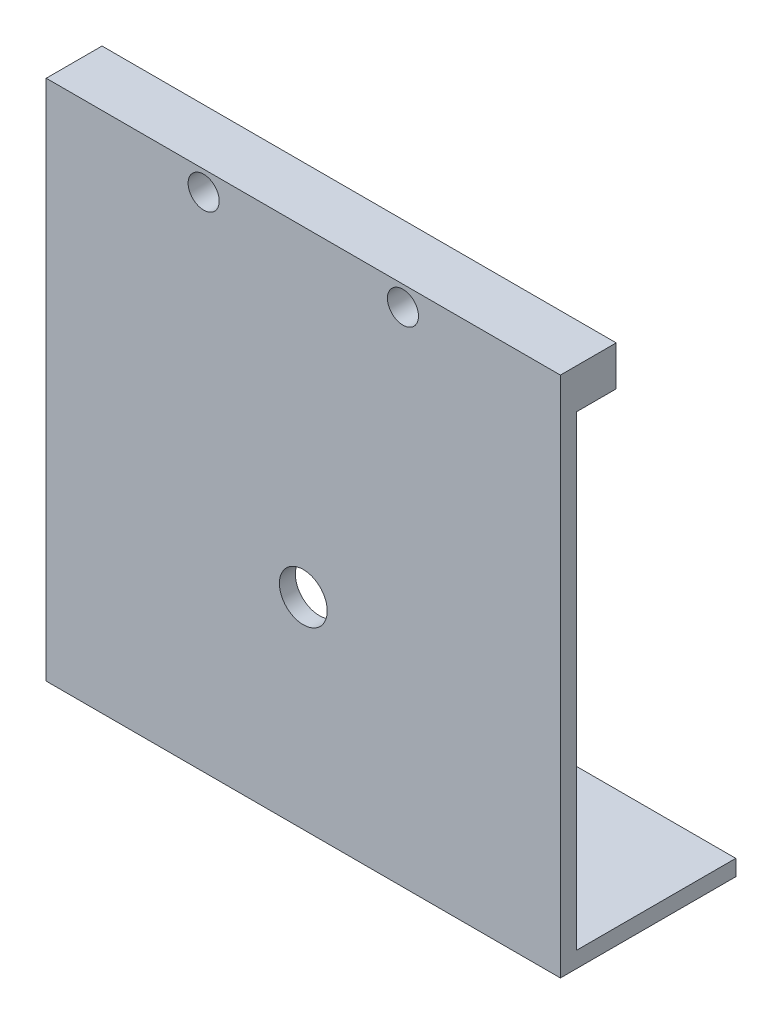
ISO-10303-21;
HEADER;
FILE_DESCRIPTION(('STEP AP214'),'2;1');
FILE_NAME('part.step','',(''),(''),'','','');
FILE_SCHEMA(('AUTOMOTIVE_DESIGN { 1 0 10303 214 1 1 1 1 }'));
ENDSEC;
DATA;
#1=APPLICATION_CONTEXT('core data for automotive mechanical design processes');
#2=APPLICATION_PROTOCOL_DEFINITION('international standard','automotive_design',2000,#1);
#3=PRODUCT_CONTEXT('',#1,'mechanical');
#4=PRODUCT('Part','Part','',(#3));
#5=PRODUCT_RELATED_PRODUCT_CATEGORY('part','',(#4));
#6=PRODUCT_DEFINITION_FORMATION('','',#4);
#7=PRODUCT_DEFINITION_CONTEXT('part definition',#1,'design');
#8=PRODUCT_DEFINITION('design','',#6,#7);
#9=PRODUCT_DEFINITION_SHAPE('','',#8);
#10=(LENGTH_UNIT() NAMED_UNIT(*) SI_UNIT(.MILLI.,.METRE.));
#11=(NAMED_UNIT(*) PLANE_ANGLE_UNIT() SI_UNIT($,.RADIAN.));
#12=(NAMED_UNIT(*) SI_UNIT($,.STERADIAN.) SOLID_ANGLE_UNIT());
#13=UNCERTAINTY_MEASURE_WITH_UNIT(LENGTH_MEASURE(1.E-05),#10,'distance_accuracy_value','');
#14=(GEOMETRIC_REPRESENTATION_CONTEXT(3) GLOBAL_UNCERTAINTY_ASSIGNED_CONTEXT((#13)) GLOBAL_UNIT_ASSIGNED_CONTEXT((#10,
#11,#12)) REPRESENTATION_CONTEXT('',''));
#15=CARTESIAN_POINT('',(0.,0.,0.));
#16=DIRECTION('',(0.,0.,1.));
#17=DIRECTION('',(1.,0.,0.));
#18=AXIS2_PLACEMENT_3D('',#15,#16,#17);
#19=CARTESIAN_POINT('',(0.,0.,0.));
#20=DIRECTION('',(0.,0.,1.));
#21=DIRECTION('',(1.,0.,0.));
#22=AXIS2_PLACEMENT_3D('',#19,#20,#21);
#23=PLANE('',#22);
#24=DIRECTION('',(1.,0.,0.));
#25=VECTOR('',#24,1.);
#26=CARTESIAN_POINT('',(-32.25,33.75,0.));
#27=LINE('',#26,#25);
#28=CARTESIAN_POINT('',(-32.25,33.75,0.));
#29=VERTEX_POINT('',#28);
#30=CARTESIAN_POINT('',(32.25,33.75,0.));
#31=VERTEX_POINT('',#30);
#32=EDGE_CURVE('E136',#29,#31,#27,.T.);
#33=ORIENTED_EDGE('',*,*,#32,.T.);
#34=DIRECTION('',(0.,1.,0.));
#35=VECTOR('',#34,1.);
#36=CARTESIAN_POINT('',(32.25,-26.75,0.));
#37=LINE('',#36,#35);
#38=CARTESIAN_POINT('',(32.25,-24.75,0.));
#39=VERTEX_POINT('',#38);
#40=EDGE_CURVE('E144',#39,#31,#37,.T.);
#41=ORIENTED_EDGE('',*,*,#40,.F.);
#42=DIRECTION('',(1.,0.,0.));
#43=VECTOR('',#42,1.);
#44=CARTESIAN_POINT('',(32.25,-24.75,0.));
#45=LINE('',#44,#43);
#46=CARTESIAN_POINT('',(-32.25,-24.75,0.));
#47=VERTEX_POINT('',#46);
#48=EDGE_CURVE('E138',#47,#39,#45,.T.);
#49=ORIENTED_EDGE('',*,*,#48,.F.);
#50=DIRECTION('',(0.,-1.,0.));
#51=VECTOR('',#50,1.);
#52=CARTESIAN_POINT('',(-32.25,-26.75,0.));
#53=LINE('',#52,#51);
#54=EDGE_CURVE('E132',#29,#47,#53,.T.);
#55=ORIENTED_EDGE('',*,*,#54,.F.);
#56=EDGE_LOOP('',(#33,#41,#49,#55));
#57=FACE_BOUND('',#56,.T.);
#58=CARTESIAN_POINT('',(0.,-1.5,0.));
#59=DIRECTION('',(0.,0.,-1.));
#60=DIRECTION('',(-1.,0.,0.));
#61=AXIS2_PLACEMENT_3D('',#58,#59,#60);
#62=CIRCLE('',#61,3.);
#63=CARTESIAN_POINT('',(-3.,-1.5,0.));
#64=VERTEX_POINT('',#63);
#65=EDGE_CURVE('E154',#64,#64,#62,.T.);
#66=ORIENTED_EDGE('',*,*,#65,.F.);
#67=EDGE_LOOP('',(#66));
#68=FACE_BOUND('',#67,.T.);
#69=ADVANCED_FACE('F65',(#57,#68),#23,.F.);
#70=CARTESIAN_POINT('',(-32.25,-26.75,2.));
#71=DIRECTION('',(1.,0.,0.));
#72=DIRECTION('',(0.,0.,-1.));
#73=AXIS2_PLACEMENT_3D('',#70,#71,#72);
#74=PLANE('',#73);
#75=ORIENTED_EDGE('',*,*,#54,.T.);
#76=DIRECTION('',(0.,0.,1.));
#77=VECTOR('',#76,1.);
#78=CARTESIAN_POINT('',(-32.25,-24.75,-20.));
#79=LINE('',#78,#77);
#80=CARTESIAN_POINT('',(-32.25,-24.75,-20.));
#81=VERTEX_POINT('',#80);
#82=EDGE_CURVE('E145',#81,#47,#79,.T.);
#83=ORIENTED_EDGE('',*,*,#82,.F.);
#84=DIRECTION('',(0.,1.,0.));
#85=VECTOR('',#84,1.);
#86=CARTESIAN_POINT('',(-32.25,-26.75,-20.));
#87=LINE('',#86,#85);
#88=CARTESIAN_POINT('',(-32.25,-26.75,-20.));
#89=VERTEX_POINT('',#88);
#90=EDGE_CURVE('E194',#89,#81,#87,.T.);
#91=ORIENTED_EDGE('',*,*,#90,.F.);
#92=DIRECTION('',(0.,0.,-1.));
#93=VECTOR('',#92,1.);
#94=CARTESIAN_POINT('',(-32.25,-26.75,2.));
#95=LINE('',#94,#93);
#96=CARTESIAN_POINT('',(-32.25,-26.75,2.));
#97=VERTEX_POINT('',#96);
#98=EDGE_CURVE('E12',#97,#89,#95,.T.);
#99=ORIENTED_EDGE('',*,*,#98,.F.);
#100=DIRECTION('',(0.,-1.,0.));
#101=VECTOR('',#100,1.);
#102=CARTESIAN_POINT('',(-32.25,-26.75,2.));
#103=LINE('',#102,#101);
#104=CARTESIAN_POINT('',(-32.25,38.75,2.));
#105=VERTEX_POINT('',#104);
#106=EDGE_CURVE('E206',#105,#97,#103,.T.);
#107=ORIENTED_EDGE('',*,*,#106,.F.);
#108=DIRECTION('',(0.,0.,-1.));
#109=VECTOR('',#108,1.);
#110=CARTESIAN_POINT('',(-32.25,38.75,2.));
#111=LINE('',#110,#109);
#112=CARTESIAN_POINT('',(-32.25,38.75,-5.));
#113=VERTEX_POINT('',#112);
#114=EDGE_CURVE('E239',#105,#113,#111,.T.);
#115=ORIENTED_EDGE('',*,*,#114,.T.);
#116=DIRECTION('',(0.,-1.,0.));
#117=VECTOR('',#116,1.);
#118=CARTESIAN_POINT('',(-32.25,38.75,-5.));
#119=LINE('',#118,#117);
#120=CARTESIAN_POINT('',(-32.25,33.75,-5.));
#121=VERTEX_POINT('',#120);
#122=EDGE_CURVE('E158',#113,#121,#119,.T.);
#123=ORIENTED_EDGE('',*,*,#122,.T.);
#124=DIRECTION('',(0.,0.,-1.));
#125=VECTOR('',#124,1.);
#126=CARTESIAN_POINT('',(-32.25,33.75,0.));
#127=LINE('',#126,#125);
#128=EDGE_CURVE('E150',#29,#121,#127,.T.);
#129=ORIENTED_EDGE('',*,*,#128,.F.);
#130=EDGE_LOOP('',(#75,#83,#91,#99,#107,#115,#123,#129));
#131=FACE_BOUND('',#130,.T.);
#132=ADVANCED_FACE('F67',(#131),#74,.F.);
#133=CARTESIAN_POINT('',(32.25,-26.75,2.));
#134=DIRECTION('',(0.,1.,0.));
#135=DIRECTION('',(-1.,0.,0.));
#136=AXIS2_PLACEMENT_3D('',#133,#134,#135);
#137=PLANE('',#136);
#138=ORIENTED_EDGE('',*,*,#98,.T.);
#139=DIRECTION('',(-1.,0.,0.));
#140=VECTOR('',#139,1.);
#141=CARTESIAN_POINT('',(32.25,-26.75,-20.));
#142=LINE('',#141,#140);
#143=CARTESIAN_POINT('',(32.25,-26.75,-20.));
#144=VERTEX_POINT('',#143);
#145=EDGE_CURVE('E190',#144,#89,#142,.T.);
#146=ORIENTED_EDGE('',*,*,#145,.F.);
#147=DIRECTION('',(0.,0.,-1.));
#148=VECTOR('',#147,1.);
#149=CARTESIAN_POINT('',(32.25,-26.75,2.));
#150=LINE('',#149,#148);
#151=CARTESIAN_POINT('',(32.25,-26.75,2.));
#152=VERTEX_POINT('',#151);
#153=EDGE_CURVE('E75',#152,#144,#150,.T.);
#154=ORIENTED_EDGE('',*,*,#153,.F.);
#155=DIRECTION('',(1.,0.,0.));
#156=VECTOR('',#155,1.);
#157=CARTESIAN_POINT('',(32.25,-26.75,2.));
#158=LINE('',#157,#156);
#159=EDGE_CURVE('E90',#97,#152,#158,.T.);
#160=ORIENTED_EDGE('',*,*,#159,.F.);
#161=EDGE_LOOP('',(#138,#146,#154,#160));
#162=FACE_BOUND('',#161,.T.);
#163=ADVANCED_FACE('F223',(#162),#137,.F.);
#164=CARTESIAN_POINT('',(32.25,-26.75,2.));
#165=DIRECTION('',(-1.,0.,0.));
#166=DIRECTION('',(0.,0.,1.));
#167=AXIS2_PLACEMENT_3D('',#164,#165,#166);
#168=PLANE('',#167);
#169=DIRECTION('',(0.,0.,-1.));
#170=VECTOR('',#169,1.);
#171=CARTESIAN_POINT('',(32.25,38.75,2.));
#172=LINE('',#171,#170);
#173=CARTESIAN_POINT('',(32.25,38.75,2.));
#174=VERTEX_POINT('',#173);
#175=CARTESIAN_POINT('',(32.25,38.75,-5.));
#176=VERTEX_POINT('',#175);
#177=EDGE_CURVE('E180',#174,#176,#172,.T.);
#178=ORIENTED_EDGE('',*,*,#177,.F.);
#179=DIRECTION('',(0.,1.,0.));
#180=VECTOR('',#179,1.);
#181=CARTESIAN_POINT('',(32.25,-26.75,2.));
#182=LINE('',#181,#180);
#183=EDGE_CURVE('E211',#152,#174,#182,.T.);
#184=ORIENTED_EDGE('',*,*,#183,.F.);
#185=ORIENTED_EDGE('',*,*,#153,.T.);
#186=DIRECTION('',(0.,-1.,0.));
#187=VECTOR('',#186,1.);
#188=CARTESIAN_POINT('',(32.25,-26.75,-20.));
#189=LINE('',#188,#187);
#190=CARTESIAN_POINT('',(32.25,-24.75,-20.));
#191=VERTEX_POINT('',#190);
#192=EDGE_CURVE('E186',#191,#144,#189,.T.);
#193=ORIENTED_EDGE('',*,*,#192,.F.);
#194=DIRECTION('',(0.,0.,1.));
#195=VECTOR('',#194,1.);
#196=CARTESIAN_POINT('',(32.25,-24.75,-20.));
#197=LINE('',#196,#195);
#198=EDGE_CURVE('E82',#191,#39,#197,.T.);
#199=ORIENTED_EDGE('',*,*,#198,.T.);
#200=ORIENTED_EDGE('',*,*,#40,.T.);
#201=DIRECTION('',(0.,0.,-1.));
#202=VECTOR('',#201,1.);
#203=CARTESIAN_POINT('',(32.25,33.75,0.));
#204=LINE('',#203,#202);
#205=CARTESIAN_POINT('',(32.25,33.75,-5.));
#206=VERTEX_POINT('',#205);
#207=EDGE_CURVE('E152',#31,#206,#204,.T.);
#208=ORIENTED_EDGE('',*,*,#207,.T.);
#209=DIRECTION('',(0.,-1.,0.));
#210=VECTOR('',#209,1.);
#211=CARTESIAN_POINT('',(32.25,38.75,-5.));
#212=LINE('',#211,#210);
#213=EDGE_CURVE('E161',#176,#206,#212,.T.);
#214=ORIENTED_EDGE('',*,*,#213,.F.);
#215=EDGE_LOOP('',(#178,#184,#185,#193,#199,#200,#208,#214));
#216=FACE_BOUND('',#215,.T.);
#217=ADVANCED_FACE('F221',(#216),#168,.F.);
#218=CARTESIAN_POINT('',(0.,0.,2.));
#219=DIRECTION('',(0.,0.,1.));
#220=DIRECTION('',(1.,0.,0.));
#221=AXIS2_PLACEMENT_3D('',#218,#219,#220);
#222=PLANE('',#221);
#223=CARTESIAN_POINT('',(12.5,36.25,2.00000000000001));
#224=DIRECTION('',(0.,0.,-1.));
#225=DIRECTION('',(0.,1.,0.));
#226=AXIS2_PLACEMENT_3D('',#223,#224,#225);
#227=CIRCLE('',#226,1.95);
#228=CARTESIAN_POINT('',(12.5,38.2,2.00000000000001));
#229=VERTEX_POINT('',#228);
#230=EDGE_CURVE('E174',#229,#229,#227,.T.);
#231=ORIENTED_EDGE('',*,*,#230,.T.);
#232=EDGE_LOOP('',(#231));
#233=FACE_BOUND('',#232,.T.);
#234=CARTESIAN_POINT('',(-12.5,36.25,2.00000000000001));
#235=DIRECTION('',(0.,0.,-1.));
#236=DIRECTION('',(0.,-1.,0.));
#237=AXIS2_PLACEMENT_3D('',#234,#235,#236);
#238=CIRCLE('',#237,1.95);
#239=CARTESIAN_POINT('',(-12.5,34.3,2.00000000000001));
#240=VERTEX_POINT('',#239);
#241=EDGE_CURVE('E246',#240,#240,#238,.T.);
#242=ORIENTED_EDGE('',*,*,#241,.T.);
#243=EDGE_LOOP('',(#242));
#244=FACE_BOUND('',#243,.T.);
#245=ORIENTED_EDGE('',*,*,#106,.T.);
#246=ORIENTED_EDGE('',*,*,#159,.T.);
#247=ORIENTED_EDGE('',*,*,#183,.T.);
#248=DIRECTION('',(1.,0.,0.));
#249=VECTOR('',#248,1.);
#250=CARTESIAN_POINT('',(-32.25,38.75,2.));
#251=LINE('',#250,#249);
#252=EDGE_CURVE('E155',#105,#174,#251,.T.);
#253=ORIENTED_EDGE('',*,*,#252,.F.);
#254=EDGE_LOOP('',(#245,#246,#247,#253));
#255=FACE_BOUND('',#254,.T.);
#256=CARTESIAN_POINT('',(0.,-1.5,2.));
#257=DIRECTION('',(0.,0.,1.));
#258=DIRECTION('',(1.,0.,0.));
#259=AXIS2_PLACEMENT_3D('',#256,#257,#258);
#260=CIRCLE('',#259,3.);
#261=CARTESIAN_POINT('',(3.,-1.5,2.));
#262=VERTEX_POINT('',#261);
#263=EDGE_CURVE('E69',#262,#262,#260,.T.);
#264=ORIENTED_EDGE('',*,*,#263,.F.);
#265=EDGE_LOOP('',(#264));
#266=FACE_BOUND('',#265,.T.);
#267=ADVANCED_FACE('F263',(#233,#244,#255,#266),#222,.T.);
#268=CARTESIAN_POINT('',(32.25,-24.75,-20.));
#269=DIRECTION('',(0.,-1.,0.));
#270=DIRECTION('',(0.,0.,-1.));
#271=AXIS2_PLACEMENT_3D('',#268,#269,#270);
#272=PLANE('',#271);
#273=ORIENTED_EDGE('',*,*,#48,.T.);
#274=ORIENTED_EDGE('',*,*,#198,.F.);
#275=DIRECTION('',(1.,0.,0.));
#276=VECTOR('',#275,1.);
#277=CARTESIAN_POINT('',(32.25,-24.75,-20.));
#278=LINE('',#277,#276);
#279=EDGE_CURVE('E197',#81,#191,#278,.T.);
#280=ORIENTED_EDGE('',*,*,#279,.F.);
#281=ORIENTED_EDGE('',*,*,#82,.T.);
#282=EDGE_LOOP('',(#273,#274,#280,#281));
#283=FACE_BOUND('',#282,.T.);
#284=ADVANCED_FACE('F230',(#283),#272,.F.);
#285=CARTESIAN_POINT('',(0.,0.,-20.));
#286=DIRECTION('',(0.,0.,1.));
#287=DIRECTION('',(1.,0.,0.));
#288=AXIS2_PLACEMENT_3D('',#285,#286,#287);
#289=PLANE('',#288);
#290=ORIENTED_EDGE('',*,*,#192,.T.);
#291=ORIENTED_EDGE('',*,*,#145,.T.);
#292=ORIENTED_EDGE('',*,*,#90,.T.);
#293=ORIENTED_EDGE('',*,*,#279,.T.);
#294=EDGE_LOOP('',(#290,#291,#292,#293));
#295=FACE_BOUND('',#294,.T.);
#296=ADVANCED_FACE('F227',(#295),#289,.F.);
#297=CARTESIAN_POINT('',(0.,-1.5,20.));
#298=DIRECTION('',(0.,0.,-1.));
#299=DIRECTION('',(-1.,0.,0.));
#300=AXIS2_PLACEMENT_3D('',#297,#298,#299);
#301=CYLINDRICAL_SURFACE('',#300,3.);
#302=ORIENTED_EDGE('',*,*,#263,.T.);
#303=EDGE_LOOP('',(#302));
#304=FACE_BOUND('',#303,.T.);
#305=ORIENTED_EDGE('',*,*,#65,.T.);
#306=EDGE_LOOP('',(#305));
#307=FACE_BOUND('',#306,.T.);
#308=ADVANCED_FACE('F275',(#304,#307),#301,.F.);
#309=CARTESIAN_POINT('',(-32.25,38.75,-5.));
#310=DIRECTION('',(0.,0.,1.));
#311=DIRECTION('',(0.,-1.,0.));
#312=AXIS2_PLACEMENT_3D('',#309,#310,#311);
#313=PLANE('',#312);
#314=CARTESIAN_POINT('',(12.5,36.25,-5.00000000000001));
#315=DIRECTION('',(0.,0.,-1.));
#316=DIRECTION('',(0.,1.,0.));
#317=AXIS2_PLACEMENT_3D('',#314,#315,#316);
#318=CIRCLE('',#317,1.95);
#319=CARTESIAN_POINT('',(12.5,38.2,-5.00000000000001));
#320=VERTEX_POINT('',#319);
#321=EDGE_CURVE('E254',#320,#320,#318,.T.);
#322=ORIENTED_EDGE('',*,*,#321,.F.);
#323=EDGE_LOOP('',(#322));
#324=FACE_BOUND('',#323,.T.);
#325=CARTESIAN_POINT('',(-12.5,36.25,-5.00000000000001));
#326=DIRECTION('',(0.,0.,-1.));
#327=DIRECTION('',(0.,-1.,0.));
#328=AXIS2_PLACEMENT_3D('',#325,#326,#327);
#329=CIRCLE('',#328,1.95);
#330=CARTESIAN_POINT('',(-12.5,34.3,-5.00000000000001));
#331=VERTEX_POINT('',#330);
#332=EDGE_CURVE('E250',#331,#331,#329,.T.);
#333=ORIENTED_EDGE('',*,*,#332,.F.);
#334=EDGE_LOOP('',(#333));
#335=FACE_BOUND('',#334,.T.);
#336=ORIENTED_EDGE('',*,*,#213,.T.);
#337=DIRECTION('',(1.,0.,0.));
#338=VECTOR('',#337,1.);
#339=CARTESIAN_POINT('',(-32.25,33.75,-5.));
#340=LINE('',#339,#338);
#341=EDGE_CURVE('E166',#121,#206,#340,.T.);
#342=ORIENTED_EDGE('',*,*,#341,.F.);
#343=ORIENTED_EDGE('',*,*,#122,.F.);
#344=DIRECTION('',(1.,0.,0.));
#345=VECTOR('',#344,1.);
#346=CARTESIAN_POINT('',(-32.25,38.75,-5.));
#347=LINE('',#346,#345);
#348=EDGE_CURVE('E176',#113,#176,#347,.T.);
#349=ORIENTED_EDGE('',*,*,#348,.T.);
#350=EDGE_LOOP('',(#336,#342,#343,#349));
#351=FACE_BOUND('',#350,.T.);
#352=ADVANCED_FACE('F233',(#324,#335,#351),#313,.F.);
#353=CARTESIAN_POINT('',(-32.25,38.75,2.));
#354=DIRECTION('',(0.,-1.,0.));
#355=DIRECTION('',(0.,0.,-1.));
#356=AXIS2_PLACEMENT_3D('',#353,#354,#355);
#357=PLANE('',#356);
#358=ORIENTED_EDGE('',*,*,#177,.T.);
#359=ORIENTED_EDGE('',*,*,#348,.F.);
#360=ORIENTED_EDGE('',*,*,#114,.F.);
#361=ORIENTED_EDGE('',*,*,#252,.T.);
#362=EDGE_LOOP('',(#358,#359,#360,#361));
#363=FACE_BOUND('',#362,.T.);
#364=ADVANCED_FACE('F237',(#363),#357,.F.);
#365=CARTESIAN_POINT('',(-32.25,33.75,0.));
#366=DIRECTION('',(0.,-1.,0.));
#367=DIRECTION('',(0.,0.,-1.));
#368=AXIS2_PLACEMENT_3D('',#365,#366,#367);
#369=PLANE('',#368);
#370=ORIENTED_EDGE('',*,*,#207,.F.);
#371=ORIENTED_EDGE('',*,*,#32,.F.);
#372=ORIENTED_EDGE('',*,*,#128,.T.);
#373=ORIENTED_EDGE('',*,*,#341,.T.);
#374=EDGE_LOOP('',(#370,#371,#372,#373));
#375=FACE_BOUND('',#374,.T.);
#376=ADVANCED_FACE('F149',(#375),#369,.T.);
#377=CARTESIAN_POINT('',(-12.5,36.25,2.00000000000001));
#378=DIRECTION('',(0.,0.,-1.));
#379=DIRECTION('',(0.,1.,0.));
#380=AXIS2_PLACEMENT_3D('',#377,#378,#379);
#381=CYLINDRICAL_SURFACE('',#380,1.95);
#382=ORIENTED_EDGE('',*,*,#241,.F.);
#383=EDGE_LOOP('',(#382));
#384=FACE_BOUND('',#383,.T.);
#385=ORIENTED_EDGE('',*,*,#332,.T.);
#386=EDGE_LOOP('',(#385));
#387=FACE_BOUND('',#386,.T.);
#388=ADVANCED_FACE('F269',(#384,#387),#381,.F.);
#389=CARTESIAN_POINT('',(12.5,36.25,2.00000000000001));
#390=DIRECTION('',(0.,0.,-1.));
#391=DIRECTION('',(0.,1.,0.));
#392=AXIS2_PLACEMENT_3D('',#389,#390,#391);
#393=CYLINDRICAL_SURFACE('',#392,1.95);
#394=ORIENTED_EDGE('',*,*,#230,.F.);
#395=EDGE_LOOP('',(#394));
#396=FACE_BOUND('',#395,.T.);
#397=ORIENTED_EDGE('',*,*,#321,.T.);
#398=EDGE_LOOP('',(#397));
#399=FACE_BOUND('',#398,.T.);
#400=ADVANCED_FACE('F266',(#396,#399),#393,.F.);
#401=CLOSED_SHELL('',(#69,#132,#163,#217,#267,#284,#296,#308,#352,#364,#376,#388,#400));
#402=MANIFOLD_SOLID_BREP('B2',#401);
#403=ADVANCED_BREP_SHAPE_REPRESENTATION('',(#18,#402),#14);
#404=SHAPE_DEFINITION_REPRESENTATION(#9,#403);
ENDSEC;
END-ISO-10303-21;
